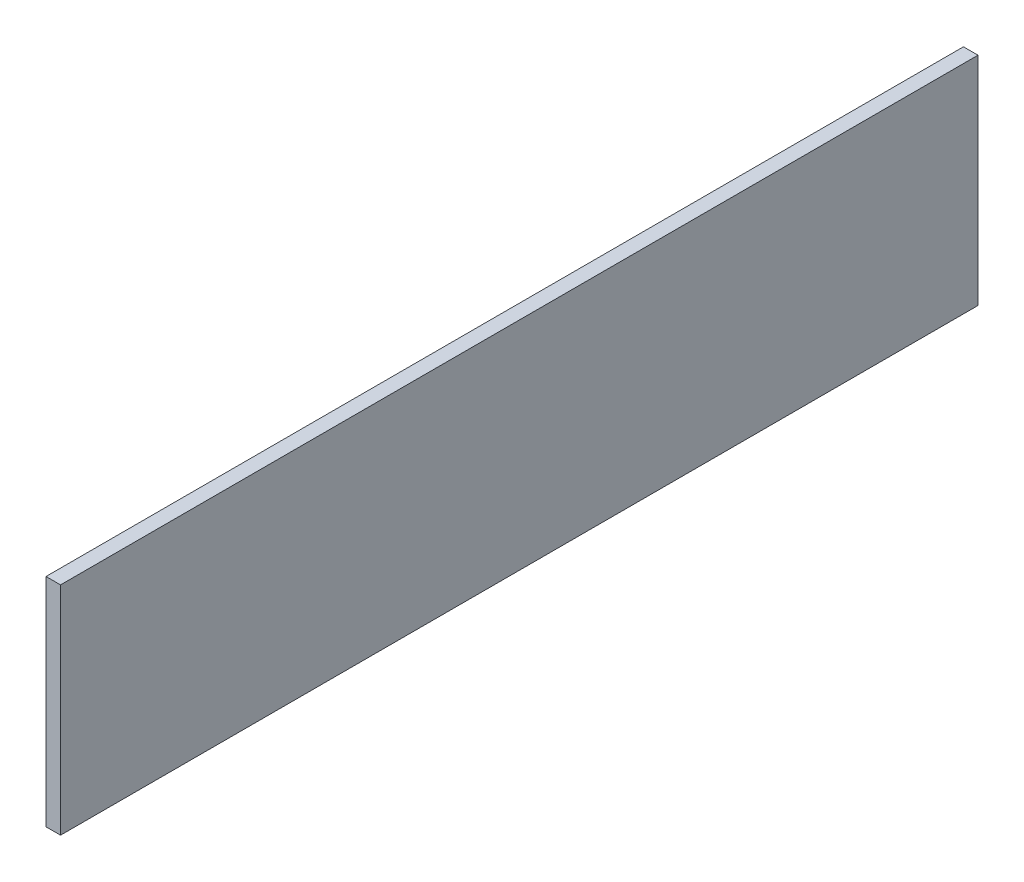
ISO-10303-21;
HEADER;
FILE_DESCRIPTION(('STEP AP214'),'2;1');
FILE_NAME('part.step','',(''),(''),'','','');
FILE_SCHEMA(('AUTOMOTIVE_DESIGN { 1 0 10303 214 1 1 1 1 }'));
ENDSEC;
DATA;
#1=APPLICATION_CONTEXT('core data for automotive mechanical design processes');
#2=APPLICATION_PROTOCOL_DEFINITION('international standard','automotive_design',2000,#1);
#3=PRODUCT_CONTEXT('',#1,'mechanical');
#4=PRODUCT('Part','Part','',(#3));
#5=PRODUCT_RELATED_PRODUCT_CATEGORY('part','',(#4));
#6=PRODUCT_DEFINITION_FORMATION('','',#4);
#7=PRODUCT_DEFINITION_CONTEXT('part definition',#1,'design');
#8=PRODUCT_DEFINITION('design','',#6,#7);
#9=PRODUCT_DEFINITION_SHAPE('','',#8);
#10=(LENGTH_UNIT() NAMED_UNIT(*) SI_UNIT(.MILLI.,.METRE.));
#11=(NAMED_UNIT(*) PLANE_ANGLE_UNIT() SI_UNIT($,.RADIAN.));
#12=(NAMED_UNIT(*) SI_UNIT($,.STERADIAN.) SOLID_ANGLE_UNIT());
#13=UNCERTAINTY_MEASURE_WITH_UNIT(LENGTH_MEASURE(1.E-05),#10,'distance_accuracy_value','');
#14=(GEOMETRIC_REPRESENTATION_CONTEXT(3) GLOBAL_UNCERTAINTY_ASSIGNED_CONTEXT((#13)) GLOBAL_UNIT_ASSIGNED_CONTEXT((#10,
#11,#12)) REPRESENTATION_CONTEXT('',''));
#15=CARTESIAN_POINT('',(0.,0.,0.));
#16=DIRECTION('',(0.,0.,1.));
#17=DIRECTION('',(1.,0.,0.));
#18=AXIS2_PLACEMENT_3D('',#15,#16,#17);
#19=CARTESIAN_POINT('',(702.,1469.,-757.5));
#20=DIRECTION('',(-1.,0.,0.));
#21=DIRECTION('',(0.,0.,1.));
#22=AXIS2_PLACEMENT_3D('',#19,#20,#21);
#23=PLANE('',#22);
#24=DIRECTION('',(0.,-1.,0.));
#25=VECTOR('',#24,1.);
#26=CARTESIAN_POINT('',(702.,1469.,0.));
#27=LINE('',#26,#25);
#28=CARTESIAN_POINT('',(702.,1648.,0.));
#29=VERTEX_POINT('',#28);
#30=CARTESIAN_POINT('',(702.,1469.,0.));
#31=VERTEX_POINT('',#30);
#32=EDGE_CURVE('E103',#29,#31,#27,.T.);
#33=ORIENTED_EDGE('',*,*,#32,.F.);
#34=DIRECTION('',(0.,0.,1.));
#35=VECTOR('',#34,1.);
#36=CARTESIAN_POINT('',(702.,1648.,-757.5));
#37=LINE('',#36,#35);
#38=CARTESIAN_POINT('',(702.,1648.,-757.5));
#39=VERTEX_POINT('',#38);
#40=EDGE_CURVE('E11',#39,#29,#37,.T.);
#41=ORIENTED_EDGE('',*,*,#40,.F.);
#42=DIRECTION('',(0.,-1.,0.));
#43=VECTOR('',#42,1.);
#44=CARTESIAN_POINT('',(702.,1469.,-757.5));
#45=LINE('',#44,#43);
#46=CARTESIAN_POINT('',(702.,1469.,-757.5));
#47=VERTEX_POINT('',#46);
#48=EDGE_CURVE('E97',#39,#47,#45,.T.);
#49=ORIENTED_EDGE('',*,*,#48,.T.);
#50=DIRECTION('',(0.,0.,1.));
#51=VECTOR('',#50,1.);
#52=CARTESIAN_POINT('',(702.,1469.,-757.5));
#53=LINE('',#52,#51);
#54=EDGE_CURVE('E42',#47,#31,#53,.T.);
#55=ORIENTED_EDGE('',*,*,#54,.T.);
#56=EDGE_LOOP('',(#33,#41,#49,#55));
#57=FACE_BOUND('',#56,.T.);
#58=ADVANCED_FACE('F39',(#57),#23,.T.);
#59=CARTESIAN_POINT('',(702.,1648.,-757.5));
#60=DIRECTION('',(0.,1.,0.));
#61=DIRECTION('',(0.,0.,1.));
#62=AXIS2_PLACEMENT_3D('',#59,#60,#61);
#63=PLANE('',#62);
#64=DIRECTION('',(-1.,0.,0.));
#65=VECTOR('',#64,1.);
#66=CARTESIAN_POINT('',(702.,1648.,0.));
#67=LINE('',#66,#65);
#68=CARTESIAN_POINT('',(714.,1648.,0.));
#69=VERTEX_POINT('',#68);
#70=EDGE_CURVE('E99',#69,#29,#67,.T.);
#71=ORIENTED_EDGE('',*,*,#70,.F.);
#72=DIRECTION('',(0.,0.,1.));
#73=VECTOR('',#72,1.);
#74=CARTESIAN_POINT('',(714.,1648.,-757.5));
#75=LINE('',#74,#73);
#76=CARTESIAN_POINT('',(714.,1648.,-757.5));
#77=VERTEX_POINT('',#76);
#78=EDGE_CURVE('E48',#77,#69,#75,.T.);
#79=ORIENTED_EDGE('',*,*,#78,.F.);
#80=DIRECTION('',(-1.,0.,0.));
#81=VECTOR('',#80,1.);
#82=CARTESIAN_POINT('',(702.,1648.,-757.5));
#83=LINE('',#82,#81);
#84=EDGE_CURVE('E94',#77,#39,#83,.T.);
#85=ORIENTED_EDGE('',*,*,#84,.T.);
#86=ORIENTED_EDGE('',*,*,#40,.T.);
#87=EDGE_LOOP('',(#71,#79,#85,#86));
#88=FACE_BOUND('',#87,.T.);
#89=ADVANCED_FACE('F113',(#88),#63,.T.);
#90=CARTESIAN_POINT('',(714.,1469.,-757.5));
#91=DIRECTION('',(1.,0.,0.));
#92=DIRECTION('',(0.,0.,-1.));
#93=AXIS2_PLACEMENT_3D('',#90,#91,#92);
#94=PLANE('',#93);
#95=DIRECTION('',(0.,1.,0.));
#96=VECTOR('',#95,1.);
#97=CARTESIAN_POINT('',(714.,1469.,0.));
#98=LINE('',#97,#96);
#99=CARTESIAN_POINT('',(714.,1469.,0.));
#100=VERTEX_POINT('',#99);
#101=EDGE_CURVE('E89',#100,#69,#98,.T.);
#102=ORIENTED_EDGE('',*,*,#101,.F.);
#103=DIRECTION('',(0.,0.,1.));
#104=VECTOR('',#103,1.);
#105=CARTESIAN_POINT('',(714.,1469.,-757.5));
#106=LINE('',#105,#104);
#107=CARTESIAN_POINT('',(714.,1469.,-757.5));
#108=VERTEX_POINT('',#107);
#109=EDGE_CURVE('E84',#108,#100,#106,.T.);
#110=ORIENTED_EDGE('',*,*,#109,.F.);
#111=DIRECTION('',(0.,1.,0.));
#112=VECTOR('',#111,1.);
#113=CARTESIAN_POINT('',(714.,1469.,-757.5));
#114=LINE('',#113,#112);
#115=EDGE_CURVE('E87',#108,#77,#114,.T.);
#116=ORIENTED_EDGE('',*,*,#115,.T.);
#117=ORIENTED_EDGE('',*,*,#78,.T.);
#118=EDGE_LOOP('',(#102,#110,#116,#117));
#119=FACE_BOUND('',#118,.T.);
#120=ADVANCED_FACE('F86',(#119),#94,.T.);
#121=CARTESIAN_POINT('',(702.,1469.,-757.5));
#122=DIRECTION('',(0.,-1.,0.));
#123=DIRECTION('',(0.,0.,-1.));
#124=AXIS2_PLACEMENT_3D('',#121,#122,#123);
#125=PLANE('',#124);
#126=DIRECTION('',(1.,0.,0.));
#127=VECTOR('',#126,1.);
#128=CARTESIAN_POINT('',(702.,1469.,0.));
#129=LINE('',#128,#127);
#130=EDGE_CURVE('E106',#31,#100,#129,.T.);
#131=ORIENTED_EDGE('',*,*,#130,.F.);
#132=ORIENTED_EDGE('',*,*,#54,.F.);
#133=DIRECTION('',(1.,0.,0.));
#134=VECTOR('',#133,1.);
#135=CARTESIAN_POINT('',(702.,1469.,-757.5));
#136=LINE('',#135,#134);
#137=EDGE_CURVE('E93',#47,#108,#136,.T.);
#138=ORIENTED_EDGE('',*,*,#137,.T.);
#139=ORIENTED_EDGE('',*,*,#109,.T.);
#140=EDGE_LOOP('',(#131,#132,#138,#139));
#141=FACE_BOUND('',#140,.T.);
#142=ADVANCED_FACE('F96',(#141),#125,.T.);
#143=CARTESIAN_POINT('',(0.,0.,-757.5));
#144=DIRECTION('',(0.,0.,-1.));
#145=DIRECTION('',(-1.,0.,0.));
#146=AXIS2_PLACEMENT_3D('',#143,#144,#145);
#147=PLANE('',#146);
#148=ORIENTED_EDGE('',*,*,#48,.F.);
#149=ORIENTED_EDGE('',*,*,#84,.F.);
#150=ORIENTED_EDGE('',*,*,#115,.F.);
#151=ORIENTED_EDGE('',*,*,#137,.F.);
#152=EDGE_LOOP('',(#148,#149,#150,#151));
#153=FACE_BOUND('',#152,.T.);
#154=ADVANCED_FACE('F92',(#153),#147,.T.);
#155=CARTESIAN_POINT('',(0.,0.,0.));
#156=DIRECTION('',(0.,0.,-1.));
#157=DIRECTION('',(-1.,0.,0.));
#158=AXIS2_PLACEMENT_3D('',#155,#156,#157);
#159=PLANE('',#158);
#160=ORIENTED_EDGE('',*,*,#32,.T.);
#161=ORIENTED_EDGE('',*,*,#130,.T.);
#162=ORIENTED_EDGE('',*,*,#101,.T.);
#163=ORIENTED_EDGE('',*,*,#70,.T.);
#164=EDGE_LOOP('',(#160,#161,#162,#163));
#165=FACE_BOUND('',#164,.T.);
#166=ADVANCED_FACE('F112',(#165),#159,.F.);
#167=CLOSED_SHELL('',(#58,#89,#120,#142,#154,#166));
#168=MANIFOLD_SOLID_BREP('B2',#167);
#169=ADVANCED_BREP_SHAPE_REPRESENTATION('',(#18,#168),#14);
#170=SHAPE_DEFINITION_REPRESENTATION(#9,#169);
ENDSEC;
END-ISO-10303-21;
